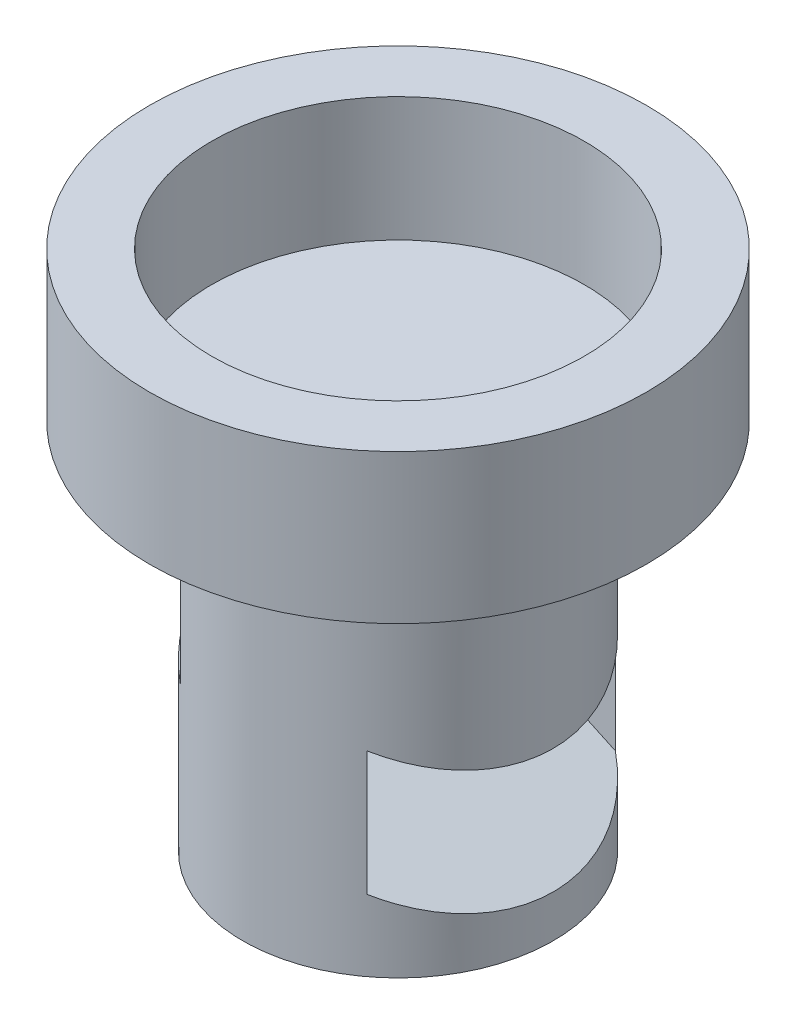
ISO-10303-21;
HEADER;
FILE_DESCRIPTION(('STEP AP214'),'2;1');
FILE_NAME('part.step','',(''),(''),'','','');
FILE_SCHEMA(('AUTOMOTIVE_DESIGN { 1 0 10303 214 1 1 1 1 }'));
ENDSEC;
DATA;
#1=APPLICATION_CONTEXT('core data for automotive mechanical design processes');
#2=APPLICATION_PROTOCOL_DEFINITION('international standard','automotive_design',2000,#1);
#3=PRODUCT_CONTEXT('',#1,'mechanical');
#4=PRODUCT('Part','Part','',(#3));
#5=PRODUCT_RELATED_PRODUCT_CATEGORY('part','',(#4));
#6=PRODUCT_DEFINITION_FORMATION('','',#4);
#7=PRODUCT_DEFINITION_CONTEXT('part definition',#1,'design');
#8=PRODUCT_DEFINITION('design','',#6,#7);
#9=PRODUCT_DEFINITION_SHAPE('','',#8);
#10=(LENGTH_UNIT() NAMED_UNIT(*) SI_UNIT(.MILLI.,.METRE.));
#11=(NAMED_UNIT(*) PLANE_ANGLE_UNIT() SI_UNIT($,.RADIAN.));
#12=(NAMED_UNIT(*) SI_UNIT($,.STERADIAN.) SOLID_ANGLE_UNIT());
#13=UNCERTAINTY_MEASURE_WITH_UNIT(LENGTH_MEASURE(1.E-05),#10,'distance_accuracy_value','');
#14=(GEOMETRIC_REPRESENTATION_CONTEXT(3) GLOBAL_UNCERTAINTY_ASSIGNED_CONTEXT((#13)) GLOBAL_UNIT_ASSIGNED_CONTEXT((#10,
#11,#12)) REPRESENTATION_CONTEXT('',''));
#15=CARTESIAN_POINT('',(0.,0.,0.));
#16=DIRECTION('',(0.,0.,1.));
#17=DIRECTION('',(1.,0.,0.));
#18=AXIS2_PLACEMENT_3D('',#15,#16,#17);
#19=CARTESIAN_POINT('',(0.,-42.,0.));
#20=DIRECTION('',(0.,1.,0.));
#21=DIRECTION('',(0.,0.,1.));
#22=AXIS2_PLACEMENT_3D('',#19,#20,#21);
#23=CYLINDRICAL_SURFACE('',#22,12.5);
#24=DIRECTION('',(0.,1.,0.));
#25=VECTOR('',#24,1.);
#26=CARTESIAN_POINT('',(-7.5,-42.,-10.));
#27=LINE('',#26,#25);
#28=CARTESIAN_POINT('',(-7.5,-19.2627239337701,-10.));
#29=VERTEX_POINT('',#28);
#30=CARTESIAN_POINT('',(-7.5,-29.2627239337701,-10.));
#31=VERTEX_POINT('',#30);
#32=EDGE_CURVE('E76',#29,#31,#27,.F.);
#33=ORIENTED_EDGE('',*,*,#32,.F.);
#34=CARTESIAN_POINT('',(0.,-22.7600313699326,0.));
#35=DIRECTION('',(0.4226182617407,0.90630778703665,0.));
#36=DIRECTION('',(-0.90630778703665,0.4226182617407,0.));
#37=AXIS2_PLACEMENT_3D('',#34,#35,#36);
#38=ELLIPSE('',#37,13.7922239870312,12.5);
#39=CARTESIAN_POINT('',(-7.5,-19.2627239337701,10.));
#40=VERTEX_POINT('',#39);
#41=EDGE_CURVE('E88',#29,#40,#38,.T.);
#42=ORIENTED_EDGE('',*,*,#41,.T.);
#43=DIRECTION('',(0.,1.,0.));
#44=VECTOR('',#43,1.);
#45=CARTESIAN_POINT('',(-7.5,-42.,10.));
#46=LINE('',#45,#44);
#47=CARTESIAN_POINT('',(-7.5,-29.2627239337701,10.));
#48=VERTEX_POINT('',#47);
#49=EDGE_CURVE('E93',#40,#48,#46,.F.);
#50=ORIENTED_EDGE('',*,*,#49,.T.);
#51=CARTESIAN_POINT('',(0.,-32.7600313699326,0.));
#52=DIRECTION('',(-0.4226182617407,-0.90630778703665,0.));
#53=DIRECTION('',(-0.90630778703665,0.4226182617407,0.));
#54=AXIS2_PLACEMENT_3D('',#51,#52,#53);
#55=ELLIPSE('',#54,13.7922239870312,12.5);
#56=EDGE_CURVE('E82',#48,#31,#55,.T.);
#57=ORIENTED_EDGE('',*,*,#56,.T.);
#58=EDGE_LOOP('',(#33,#42,#50,#57));
#59=FACE_BOUND('',#58,.T.);
#60=CARTESIAN_POINT('',(0.,-42.,0.));
#61=DIRECTION('',(0.,-1.,0.));
#62=DIRECTION('',(0.,0.,-1.));
#63=AXIS2_PLACEMENT_3D('',#60,#61,#62);
#64=CIRCLE('',#63,12.5);
#65=CARTESIAN_POINT('',(0.,-42.,-12.5));
#66=VERTEX_POINT('',#65);
#67=EDGE_CURVE('E108',#66,#66,#64,.T.);
#68=ORIENTED_EDGE('',*,*,#67,.F.);
#69=EDGE_LOOP('',(#68));
#70=FACE_BOUND('',#69,.T.);
#71=CARTESIAN_POINT('',(0.,-12.,0.));
#72=DIRECTION('',(0.,-1.,0.));
#73=DIRECTION('',(0.,0.,-1.));
#74=AXIS2_PLACEMENT_3D('',#71,#72,#73);
#75=CIRCLE('',#74,12.5);
#76=CARTESIAN_POINT('',(0.,-12.,-12.5));
#77=VERTEX_POINT('',#76);
#78=EDGE_CURVE('E109',#77,#77,#75,.T.);
#79=ORIENTED_EDGE('',*,*,#78,.T.);
#80=EDGE_LOOP('',(#79));
#81=FACE_BOUND('',#80,.T.);
#82=DIRECTION('',(0.,1.,0.));
#83=VECTOR('',#82,1.);
#84=CARTESIAN_POINT('',(7.5,-42.,-10.));
#85=LINE('',#84,#83);
#86=CARTESIAN_POINT('',(7.5,-36.2573388060951,-10.));
#87=VERTEX_POINT('',#86);
#88=CARTESIAN_POINT('',(7.5,-26.2573388060951,-10.));
#89=VERTEX_POINT('',#88);
#90=EDGE_CURVE('E11',#87,#89,#85,.T.);
#91=ORIENTED_EDGE('',*,*,#90,.F.);
#92=CARTESIAN_POINT('',(7.5,-36.2573388060951,10.));
#93=VERTEX_POINT('',#92);
#94=EDGE_CURVE('E41',#87,#93,#55,.T.);
#95=ORIENTED_EDGE('',*,*,#94,.T.);
#96=DIRECTION('',(0.,1.,0.));
#97=VECTOR('',#96,1.);
#98=CARTESIAN_POINT('',(7.5,-42.,10.));
#99=LINE('',#98,#97);
#100=CARTESIAN_POINT('',(7.5,-26.2573388060951,10.));
#101=VERTEX_POINT('',#100);
#102=EDGE_CURVE('E70',#93,#101,#99,.T.);
#103=ORIENTED_EDGE('',*,*,#102,.T.);
#104=EDGE_CURVE('E75',#101,#89,#38,.T.);
#105=ORIENTED_EDGE('',*,*,#104,.T.);
#106=EDGE_LOOP('',(#91,#95,#103,#105));
#107=FACE_BOUND('',#106,.T.);
#108=ADVANCED_FACE('F33',(#59,#70,#81,#107),#23,.T.);
#109=CARTESIAN_POINT('',(0.,-12.,0.));
#110=DIRECTION('',(0.,-1.,0.));
#111=DIRECTION('',(0.,0.,-1.));
#112=AXIS2_PLACEMENT_3D('',#109,#110,#111);
#113=PLANE('',#112);
#114=CARTESIAN_POINT('',(0.,-12.,0.));
#115=DIRECTION('',(0.,-1.,0.));
#116=DIRECTION('',(0.,0.,-1.));
#117=AXIS2_PLACEMENT_3D('',#114,#115,#116);
#118=CIRCLE('',#117,20.);
#119=CARTESIAN_POINT('',(0.,-12.,-20.));
#120=VERTEX_POINT('',#119);
#121=EDGE_CURVE('E103',#120,#120,#118,.T.);
#122=ORIENTED_EDGE('',*,*,#121,.T.);
#123=EDGE_LOOP('',(#122));
#124=FACE_BOUND('',#123,.T.);
#125=ORIENTED_EDGE('',*,*,#78,.F.);
#126=EDGE_LOOP('',(#125));
#127=FACE_BOUND('',#126,.T.);
#128=ADVANCED_FACE('F124',(#124,#127),#113,.T.);
#129=CARTESIAN_POINT('',(0.,-10.,0.));
#130=DIRECTION('',(0.,1.,0.));
#131=DIRECTION('',(0.,0.,1.));
#132=AXIS2_PLACEMENT_3D('',#129,#130,#131);
#133=CYLINDRICAL_SURFACE('',#132,20.);
#134=CARTESIAN_POINT('',(0.,0.,0.));
#135=DIRECTION('',(0.,1.,0.));
#136=DIRECTION('',(0.,0.,1.));
#137=AXIS2_PLACEMENT_3D('',#134,#135,#136);
#138=CIRCLE('',#137,20.);
#139=CARTESIAN_POINT('',(0.,0.,20.));
#140=VERTEX_POINT('',#139);
#141=EDGE_CURVE('E94',#140,#140,#138,.T.);
#142=ORIENTED_EDGE('',*,*,#141,.F.);
#143=EDGE_LOOP('',(#142));
#144=FACE_BOUND('',#143,.T.);
#145=ORIENTED_EDGE('',*,*,#121,.F.);
#146=EDGE_LOOP('',(#145));
#147=FACE_BOUND('',#146,.T.);
#148=ADVANCED_FACE('F35',(#144,#147),#133,.T.);
#149=CARTESIAN_POINT('',(0.,0.,0.));
#150=DIRECTION('',(0.,1.,0.));
#151=DIRECTION('',(0.,0.,1.));
#152=AXIS2_PLACEMENT_3D('',#149,#150,#151);
#153=PLANE('',#152);
#154=CARTESIAN_POINT('',(0.,0.,0.));
#155=DIRECTION('',(0.,1.,0.));
#156=DIRECTION('',(0.,0.,1.));
#157=AXIS2_PLACEMENT_3D('',#154,#155,#156);
#158=CIRCLE('',#157,15.);
#159=CARTESIAN_POINT('',(0.,0.,15.));
#160=VERTEX_POINT('',#159);
#161=EDGE_CURVE('E100',#160,#160,#158,.T.);
#162=ORIENTED_EDGE('',*,*,#161,.F.);
#163=EDGE_LOOP('',(#162));
#164=FACE_BOUND('',#163,.T.);
#165=ORIENTED_EDGE('',*,*,#141,.T.);
#166=EDGE_LOOP('',(#165));
#167=FACE_BOUND('',#166,.T.);
#168=ADVANCED_FACE('F136',(#164,#167),#153,.T.);
#169=CARTESIAN_POINT('',(0.,-10.,0.));
#170=DIRECTION('',(0.,1.,0.));
#171=DIRECTION('',(0.,0.,1.));
#172=AXIS2_PLACEMENT_3D('',#169,#170,#171);
#173=CYLINDRICAL_SURFACE('',#172,15.);
#174=CARTESIAN_POINT('',(0.,-10.,0.));
#175=DIRECTION('',(0.,1.,0.));
#176=DIRECTION('',(0.,0.,1.));
#177=AXIS2_PLACEMENT_3D('',#174,#175,#176);
#178=CIRCLE('',#177,15.);
#179=CARTESIAN_POINT('',(0.,-10.,15.));
#180=VERTEX_POINT('',#179);
#181=EDGE_CURVE('E99',#180,#180,#178,.T.);
#182=ORIENTED_EDGE('',*,*,#181,.F.);
#183=EDGE_LOOP('',(#182));
#184=FACE_BOUND('',#183,.T.);
#185=ORIENTED_EDGE('',*,*,#161,.T.);
#186=EDGE_LOOP('',(#185));
#187=FACE_BOUND('',#186,.T.);
#188=ADVANCED_FACE('F144',(#184,#187),#173,.F.);
#189=CARTESIAN_POINT('',(0.,-10.,0.));
#190=DIRECTION('',(0.,-1.,0.));
#191=DIRECTION('',(0.,0.,-1.));
#192=AXIS2_PLACEMENT_3D('',#189,#190,#191);
#193=PLANE('',#192);
#194=ORIENTED_EDGE('',*,*,#181,.T.);
#195=EDGE_LOOP('',(#194));
#196=FACE_BOUND('',#195,.T.);
#197=ADVANCED_FACE('F140',(#196),#193,.F.);
#198=CARTESIAN_POINT('',(0.,-42.,0.));
#199=DIRECTION('',(0.,-1.,0.));
#200=DIRECTION('',(0.,0.,-1.));
#201=AXIS2_PLACEMENT_3D('',#198,#199,#200);
#202=PLANE('',#201);
#203=ORIENTED_EDGE('',*,*,#67,.T.);
#204=EDGE_LOOP('',(#203));
#205=FACE_BOUND('',#204,.T.);
#206=ADVANCED_FACE('F143',(#205),#202,.T.);
#207=CARTESIAN_POINT('',(-15.5460906288032,-25.51077025535,-10.));
#208=DIRECTION('',(-0.4226182617407,-0.90630778703665,0.));
#209=DIRECTION('',(0.90630778703665,-0.4226182617407,0.));
#210=AXIS2_PLACEMENT_3D('',#207,#208,#209);
#211=PLANE('',#210);
#212=DIRECTION('',(0.90630778703665,-0.4226182617407,0.));
#213=VECTOR('',#212,1.);
#214=CARTESIAN_POINT('',(-15.5460906288032,-25.51077025535,-10.));
#215=LINE('',#214,#213);
#216=EDGE_CURVE('E115',#31,#87,#215,.T.);
#217=ORIENTED_EDGE('',*,*,#216,.F.);
#218=ORIENTED_EDGE('',*,*,#56,.F.);
#219=DIRECTION('',(0.90630778703665,-0.4226182617407,0.));
#220=VECTOR('',#219,1.);
#221=CARTESIAN_POINT('',(-15.5460906288032,-25.51077025535,10.));
#222=LINE('',#221,#220);
#223=EDGE_CURVE('E53',#48,#93,#222,.T.);
#224=ORIENTED_EDGE('',*,*,#223,.T.);
#225=ORIENTED_EDGE('',*,*,#94,.F.);
#226=EDGE_LOOP('',(#217,#218,#224,#225));
#227=FACE_BOUND('',#226,.T.);
#228=ADVANCED_FACE('F79',(#227),#211,.F.);
#229=CARTESIAN_POINT('',(14.4539093711968,-29.5,-10.));
#230=DIRECTION('',(0.4226182617407,0.90630778703665,0.));
#231=DIRECTION('',(-0.90630778703665,0.4226182617407,0.));
#232=AXIS2_PLACEMENT_3D('',#229,#230,#231);
#233=PLANE('',#232);
#234=DIRECTION('',(-0.90630778703665,0.4226182617407,0.));
#235=VECTOR('',#234,1.);
#236=CARTESIAN_POINT('',(14.4539093711968,-29.5,10.));
#237=LINE('',#236,#235);
#238=EDGE_CURVE('E48',#101,#40,#237,.T.);
#239=ORIENTED_EDGE('',*,*,#238,.T.);
#240=ORIENTED_EDGE('',*,*,#41,.F.);
#241=DIRECTION('',(-0.90630778703665,0.4226182617407,0.));
#242=VECTOR('',#241,1.);
#243=CARTESIAN_POINT('',(14.4539093711968,-29.5,-10.));
#244=LINE('',#243,#242);
#245=EDGE_CURVE('E112',#89,#29,#244,.T.);
#246=ORIENTED_EDGE('',*,*,#245,.F.);
#247=ORIENTED_EDGE('',*,*,#104,.F.);
#248=EDGE_LOOP('',(#239,#240,#246,#247));
#249=FACE_BOUND('',#248,.T.);
#250=ADVANCED_FACE('F181',(#249),#233,.F.);
#251=CARTESIAN_POINT('',(0.,0.,-10.));
#252=DIRECTION('',(0.,0.,1.));
#253=DIRECTION('',(1.,0.,0.));
#254=AXIS2_PLACEMENT_3D('',#251,#252,#253);
#255=PLANE('',#254);
#256=ORIENTED_EDGE('',*,*,#90,.T.);
#257=ORIENTED_EDGE('',*,*,#245,.T.);
#258=ORIENTED_EDGE('',*,*,#32,.T.);
#259=ORIENTED_EDGE('',*,*,#216,.T.);
#260=EDGE_LOOP('',(#256,#257,#258,#259));
#261=FACE_BOUND('',#260,.T.);
#262=ADVANCED_FACE('F120',(#261),#255,.T.);
#263=CARTESIAN_POINT('',(0.,0.,10.));
#264=DIRECTION('',(0.,0.,1.));
#265=DIRECTION('',(1.,0.,0.));
#266=AXIS2_PLACEMENT_3D('',#263,#264,#265);
#267=PLANE('',#266);
#268=ORIENTED_EDGE('',*,*,#223,.F.);
#269=ORIENTED_EDGE('',*,*,#49,.F.);
#270=ORIENTED_EDGE('',*,*,#238,.F.);
#271=ORIENTED_EDGE('',*,*,#102,.F.);
#272=EDGE_LOOP('',(#268,#269,#270,#271));
#273=FACE_BOUND('',#272,.T.);
#274=ADVANCED_FACE('F71',(#273),#267,.F.);
#275=CLOSED_SHELL('',(#108,#128,#148,#168,#188,#197,#206,#228,#250,#262,#274));
#276=MANIFOLD_SOLID_BREP('B2',#275);
#277=ADVANCED_BREP_SHAPE_REPRESENTATION('',(#18,#276),#14);
#278=SHAPE_DEFINITION_REPRESENTATION(#9,#277);
ENDSEC;
END-ISO-10303-21;
